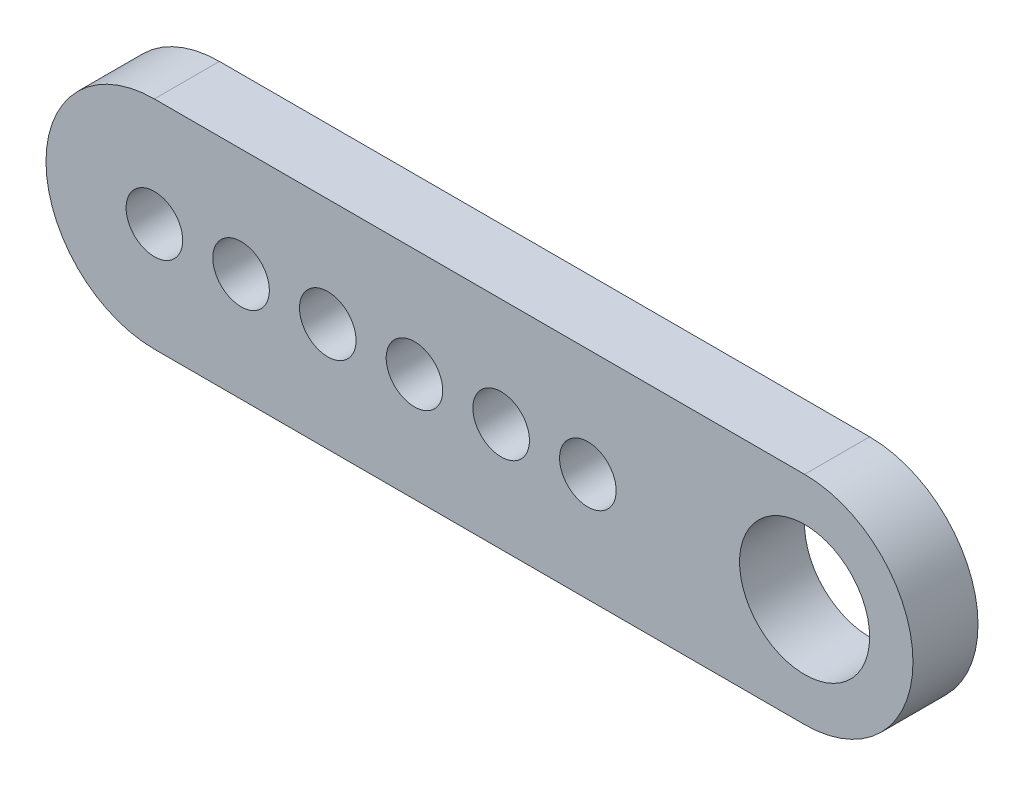
ISO-10303-21;
HEADER;
FILE_DESCRIPTION(('STEP AP214'),'2;1');
FILE_NAME('part.step','',(''),(''),'','','');
FILE_SCHEMA(('AUTOMOTIVE_DESIGN { 1 0 10303 214 1 1 1 1 }'));
ENDSEC;
DATA;
#1=APPLICATION_CONTEXT('core data for automotive mechanical design processes');
#2=APPLICATION_PROTOCOL_DEFINITION('international standard','automotive_design',2000,#1);
#3=PRODUCT_CONTEXT('',#1,'mechanical');
#4=PRODUCT('Part','Part','',(#3));
#5=PRODUCT_RELATED_PRODUCT_CATEGORY('part','',(#4));
#6=PRODUCT_DEFINITION_FORMATION('','',#4);
#7=PRODUCT_DEFINITION_CONTEXT('part definition',#1,'design');
#8=PRODUCT_DEFINITION('design','',#6,#7);
#9=PRODUCT_DEFINITION_SHAPE('','',#8);
#10=(LENGTH_UNIT() NAMED_UNIT(*) SI_UNIT(.MILLI.,.METRE.));
#11=(NAMED_UNIT(*) PLANE_ANGLE_UNIT() SI_UNIT($,.RADIAN.));
#12=(NAMED_UNIT(*) SI_UNIT($,.STERADIAN.) SOLID_ANGLE_UNIT());
#13=UNCERTAINTY_MEASURE_WITH_UNIT(LENGTH_MEASURE(1.E-05),#10,'distance_accuracy_value','');
#14=(GEOMETRIC_REPRESENTATION_CONTEXT(3) GLOBAL_UNCERTAINTY_ASSIGNED_CONTEXT((#13)) GLOBAL_UNIT_ASSIGNED_CONTEXT((#10,
#11,#12)) REPRESENTATION_CONTEXT('',''));
#15=CARTESIAN_POINT('',(0.,0.,0.));
#16=DIRECTION('',(0.,0.,1.));
#17=DIRECTION('',(1.,0.,0.));
#18=AXIS2_PLACEMENT_3D('',#15,#16,#17);
#19=CARTESIAN_POINT('',(0.,5.,3.));
#20=DIRECTION('',(0.,1.,0.));
#21=DIRECTION('',(0.,0.,1.));
#22=AXIS2_PLACEMENT_3D('',#19,#20,#21);
#23=PLANE('',#22);
#24=DIRECTION('',(1.,0.,0.));
#25=VECTOR('',#24,1.);
#26=CARTESIAN_POINT('',(0.,5.,0.));
#27=LINE('',#26,#25);
#28=CARTESIAN_POINT('',(-30.,5.,0.));
#29=VERTEX_POINT('',#28);
#30=CARTESIAN_POINT('',(0.,5.,0.));
#31=VERTEX_POINT('',#30);
#32=EDGE_CURVE('E125',#29,#31,#27,.T.);
#33=ORIENTED_EDGE('',*,*,#32,.F.);
#34=DIRECTION('',(0.,0.,-1.));
#35=VECTOR('',#34,1.);
#36=CARTESIAN_POINT('',(-30.,5.,3.));
#37=LINE('',#36,#35);
#38=CARTESIAN_POINT('',(-30.,5.,3.));
#39=VERTEX_POINT('',#38);
#40=EDGE_CURVE('E11',#39,#29,#37,.T.);
#41=ORIENTED_EDGE('',*,*,#40,.F.);
#42=DIRECTION('',(1.,0.,0.));
#43=VECTOR('',#42,1.);
#44=CARTESIAN_POINT('',(0.,5.,3.));
#45=LINE('',#44,#43);
#46=CARTESIAN_POINT('',(0.,5.,3.));
#47=VERTEX_POINT('',#46);
#48=EDGE_CURVE('E89',#39,#47,#45,.T.);
#49=ORIENTED_EDGE('',*,*,#48,.T.);
#50=DIRECTION('',(0.,0.,-1.));
#51=VECTOR('',#50,1.);
#52=CARTESIAN_POINT('',(0.,5.,3.));
#53=LINE('',#52,#51);
#54=EDGE_CURVE('E78',#47,#31,#53,.T.);
#55=ORIENTED_EDGE('',*,*,#54,.T.);
#56=EDGE_LOOP('',(#33,#41,#49,#55));
#57=FACE_BOUND('',#56,.T.);
#58=ADVANCED_FACE('F39',(#57),#23,.T.);
#59=CARTESIAN_POINT('',(-30.,0.,3.));
#60=DIRECTION('',(0.,0.,-1.));
#61=DIRECTION('',(-1.,0.,0.));
#62=AXIS2_PLACEMENT_3D('',#59,#60,#61);
#63=CYLINDRICAL_SURFACE('',#62,5.);
#64=CARTESIAN_POINT('',(-30.,0.,0.));
#65=DIRECTION('',(0.,0.,1.));
#66=DIRECTION('',(1.,0.,0.));
#67=AXIS2_PLACEMENT_3D('',#64,#65,#66);
#68=CIRCLE('',#67,5.);
#69=CARTESIAN_POINT('',(-30.,-5.,0.));
#70=VERTEX_POINT('',#69);
#71=EDGE_CURVE('E95',#29,#70,#68,.T.);
#72=ORIENTED_EDGE('',*,*,#71,.T.);
#73=DIRECTION('',(0.,0.,-1.));
#74=VECTOR('',#73,1.);
#75=CARTESIAN_POINT('',(-30.,-5.,3.));
#76=LINE('',#75,#74);
#77=CARTESIAN_POINT('',(-30.,-5.,3.));
#78=VERTEX_POINT('',#77);
#79=EDGE_CURVE('E48',#78,#70,#76,.T.);
#80=ORIENTED_EDGE('',*,*,#79,.F.);
#81=CARTESIAN_POINT('',(-30.,0.,3.));
#82=DIRECTION('',(0.,0.,1.));
#83=DIRECTION('',(1.,0.,0.));
#84=AXIS2_PLACEMENT_3D('',#81,#82,#83);
#85=CIRCLE('',#84,5.);
#86=EDGE_CURVE('E83',#39,#78,#85,.T.);
#87=ORIENTED_EDGE('',*,*,#86,.F.);
#88=ORIENTED_EDGE('',*,*,#40,.T.);
#89=EDGE_LOOP('',(#72,#80,#87,#88));
#90=FACE_BOUND('',#89,.T.);
#91=ADVANCED_FACE('F93',(#90),#63,.T.);
#92=CARTESIAN_POINT('',(0.,-5.,3.));
#93=DIRECTION('',(0.,-1.,0.));
#94=DIRECTION('',(0.,0.,-1.));
#95=AXIS2_PLACEMENT_3D('',#92,#93,#94);
#96=PLANE('',#95);
#97=DIRECTION('',(-1.,0.,0.));
#98=VECTOR('',#97,1.);
#99=CARTESIAN_POINT('',(0.,-5.,0.));
#100=LINE('',#99,#98);
#101=CARTESIAN_POINT('',(0.,-5.,0.));
#102=VERTEX_POINT('',#101);
#103=EDGE_CURVE('E129',#102,#70,#100,.T.);
#104=ORIENTED_EDGE('',*,*,#103,.F.);
#105=DIRECTION('',(0.,0.,-1.));
#106=VECTOR('',#105,1.);
#107=CARTESIAN_POINT('',(0.,-5.,3.));
#108=LINE('',#107,#106);
#109=CARTESIAN_POINT('',(0.,-5.,3.));
#110=VERTEX_POINT('',#109);
#111=EDGE_CURVE('E71',#110,#102,#108,.T.);
#112=ORIENTED_EDGE('',*,*,#111,.F.);
#113=DIRECTION('',(-1.,0.,0.));
#114=VECTOR('',#113,1.);
#115=CARTESIAN_POINT('',(0.,-5.,3.));
#116=LINE('',#115,#114);
#117=EDGE_CURVE('E88',#110,#78,#116,.T.);
#118=ORIENTED_EDGE('',*,*,#117,.T.);
#119=ORIENTED_EDGE('',*,*,#79,.T.);
#120=EDGE_LOOP('',(#104,#112,#118,#119));
#121=FACE_BOUND('',#120,.T.);
#122=ADVANCED_FACE('F99',(#121),#96,.T.);
#123=CARTESIAN_POINT('',(0.,0.,3.));
#124=DIRECTION('',(0.,0.,-1.));
#125=DIRECTION('',(-1.,0.,0.));
#126=AXIS2_PLACEMENT_3D('',#123,#124,#125);
#127=CYLINDRICAL_SURFACE('',#126,5.);
#128=CARTESIAN_POINT('',(0.,0.,0.));
#129=DIRECTION('',(0.,0.,1.));
#130=DIRECTION('',(1.,0.,0.));
#131=AXIS2_PLACEMENT_3D('',#128,#129,#130);
#132=CIRCLE('',#131,5.);
#133=EDGE_CURVE('E131',#102,#31,#132,.T.);
#134=ORIENTED_EDGE('',*,*,#133,.T.);
#135=ORIENTED_EDGE('',*,*,#54,.F.);
#136=CARTESIAN_POINT('',(0.,0.,3.));
#137=DIRECTION('',(0.,0.,1.));
#138=DIRECTION('',(1.,0.,0.));
#139=AXIS2_PLACEMENT_3D('',#136,#137,#138);
#140=CIRCLE('',#139,5.);
#141=EDGE_CURVE('E56',#110,#47,#140,.T.);
#142=ORIENTED_EDGE('',*,*,#141,.F.);
#143=ORIENTED_EDGE('',*,*,#111,.T.);
#144=EDGE_LOOP('',(#134,#135,#142,#143));
#145=FACE_BOUND('',#144,.T.);
#146=ADVANCED_FACE('F171',(#145),#127,.T.);
#147=CARTESIAN_POINT('',(-30.,0.,3.));
#148=DIRECTION('',(0.,0.,-1.));
#149=DIRECTION('',(-1.,0.,0.));
#150=AXIS2_PLACEMENT_3D('',#147,#148,#149);
#151=CYLINDRICAL_SURFACE('',#150,1.30510347340224);
#152=CARTESIAN_POINT('',(-30.,0.,3.));
#153=DIRECTION('',(0.,0.,1.));
#154=DIRECTION('',(1.,0.,0.));
#155=AXIS2_PLACEMENT_3D('',#152,#153,#154);
#156=CIRCLE('',#155,1.30510347340224);
#157=CARTESIAN_POINT('',(-28.6948965265978,0.,3.));
#158=VERTEX_POINT('',#157);
#159=EDGE_CURVE('E157',#158,#158,#156,.T.);
#160=ORIENTED_EDGE('',*,*,#159,.T.);
#161=EDGE_LOOP('',(#160));
#162=FACE_BOUND('',#161,.T.);
#163=CARTESIAN_POINT('',(-30.,0.,0.));
#164=DIRECTION('',(0.,0.,1.));
#165=DIRECTION('',(1.,0.,0.));
#166=AXIS2_PLACEMENT_3D('',#163,#164,#165);
#167=CIRCLE('',#166,1.30510347340224);
#168=CARTESIAN_POINT('',(-28.6948965265978,0.,0.));
#169=VERTEX_POINT('',#168);
#170=EDGE_CURVE('E122',#169,#169,#167,.T.);
#171=ORIENTED_EDGE('',*,*,#170,.F.);
#172=EDGE_LOOP('',(#171));
#173=FACE_BOUND('',#172,.T.);
#174=ADVANCED_FACE('F167',(#162,#173),#151,.F.);
#175=CARTESIAN_POINT('',(-26.,0.,3.));
#176=DIRECTION('',(0.,0.,-1.));
#177=DIRECTION('',(-1.,0.,0.));
#178=AXIS2_PLACEMENT_3D('',#175,#176,#177);
#179=CYLINDRICAL_SURFACE('',#178,1.30510347340224);
#180=CARTESIAN_POINT('',(-26.,0.,3.));
#181=DIRECTION('',(0.,0.,1.));
#182=DIRECTION('',(1.,0.,0.));
#183=AXIS2_PLACEMENT_3D('',#180,#181,#182);
#184=CIRCLE('',#183,1.30510347340224);
#185=CARTESIAN_POINT('',(-24.6948965265978,0.,3.));
#186=VERTEX_POINT('',#185);
#187=EDGE_CURVE('E154',#186,#186,#184,.T.);
#188=ORIENTED_EDGE('',*,*,#187,.T.);
#189=EDGE_LOOP('',(#188));
#190=FACE_BOUND('',#189,.T.);
#191=CARTESIAN_POINT('',(-26.,0.,0.));
#192=DIRECTION('',(0.,0.,1.));
#193=DIRECTION('',(1.,0.,0.));
#194=AXIS2_PLACEMENT_3D('',#191,#192,#193);
#195=CIRCLE('',#194,1.30510347340224);
#196=CARTESIAN_POINT('',(-24.6948965265978,0.,0.));
#197=VERTEX_POINT('',#196);
#198=EDGE_CURVE('E119',#197,#197,#195,.T.);
#199=ORIENTED_EDGE('',*,*,#198,.F.);
#200=EDGE_LOOP('',(#199));
#201=FACE_BOUND('',#200,.T.);
#202=ADVANCED_FACE('F170',(#190,#201),#179,.F.);
#203=CARTESIAN_POINT('',(-22.,0.,3.));
#204=DIRECTION('',(0.,0.,-1.));
#205=DIRECTION('',(-1.,0.,0.));
#206=AXIS2_PLACEMENT_3D('',#203,#204,#205);
#207=CYLINDRICAL_SURFACE('',#206,1.30510347340224);
#208=CARTESIAN_POINT('',(-22.,0.,3.));
#209=DIRECTION('',(0.,0.,1.));
#210=DIRECTION('',(1.,0.,0.));
#211=AXIS2_PLACEMENT_3D('',#208,#209,#210);
#212=CIRCLE('',#211,1.30510347340224);
#213=CARTESIAN_POINT('',(-20.6948965265978,0.,3.));
#214=VERTEX_POINT('',#213);
#215=EDGE_CURVE('E151',#214,#214,#212,.T.);
#216=ORIENTED_EDGE('',*,*,#215,.T.);
#217=EDGE_LOOP('',(#216));
#218=FACE_BOUND('',#217,.T.);
#219=CARTESIAN_POINT('',(-22.,0.,0.));
#220=DIRECTION('',(0.,0.,1.));
#221=DIRECTION('',(1.,0.,0.));
#222=AXIS2_PLACEMENT_3D('',#219,#220,#221);
#223=CIRCLE('',#222,1.30510347340224);
#224=CARTESIAN_POINT('',(-20.6948965265978,0.,0.));
#225=VERTEX_POINT('',#224);
#226=EDGE_CURVE('E116',#225,#225,#223,.T.);
#227=ORIENTED_EDGE('',*,*,#226,.F.);
#228=EDGE_LOOP('',(#227));
#229=FACE_BOUND('',#228,.T.);
#230=ADVANCED_FACE('F175',(#218,#229),#207,.F.);
#231=CARTESIAN_POINT('',(-18.,0.,3.));
#232=DIRECTION('',(0.,0.,-1.));
#233=DIRECTION('',(-1.,0.,0.));
#234=AXIS2_PLACEMENT_3D('',#231,#232,#233);
#235=CYLINDRICAL_SURFACE('',#234,1.30510347340224);
#236=CARTESIAN_POINT('',(-18.,0.,3.));
#237=DIRECTION('',(0.,0.,1.));
#238=DIRECTION('',(1.,0.,0.));
#239=AXIS2_PLACEMENT_3D('',#236,#237,#238);
#240=CIRCLE('',#239,1.30510347340224);
#241=CARTESIAN_POINT('',(-16.6948965265978,0.,3.));
#242=VERTEX_POINT('',#241);
#243=EDGE_CURVE('E146',#242,#242,#240,.T.);
#244=ORIENTED_EDGE('',*,*,#243,.T.);
#245=EDGE_LOOP('',(#244));
#246=FACE_BOUND('',#245,.T.);
#247=CARTESIAN_POINT('',(-18.,0.,0.));
#248=DIRECTION('',(0.,0.,1.));
#249=DIRECTION('',(1.,0.,0.));
#250=AXIS2_PLACEMENT_3D('',#247,#248,#249);
#251=CIRCLE('',#250,1.30510347340224);
#252=CARTESIAN_POINT('',(-16.6948965265978,0.,0.));
#253=VERTEX_POINT('',#252);
#254=EDGE_CURVE('E113',#253,#253,#251,.T.);
#255=ORIENTED_EDGE('',*,*,#254,.F.);
#256=EDGE_LOOP('',(#255));
#257=FACE_BOUND('',#256,.T.);
#258=ADVANCED_FACE('F179',(#246,#257),#235,.F.);
#259=CARTESIAN_POINT('',(-14.,0.,3.));
#260=DIRECTION('',(0.,0.,-1.));
#261=DIRECTION('',(-1.,0.,0.));
#262=AXIS2_PLACEMENT_3D('',#259,#260,#261);
#263=CYLINDRICAL_SURFACE('',#262,1.30510347340224);
#264=CARTESIAN_POINT('',(-14.,0.,3.));
#265=DIRECTION('',(0.,0.,1.));
#266=DIRECTION('',(1.,0.,0.));
#267=AXIS2_PLACEMENT_3D('',#264,#265,#266);
#268=CIRCLE('',#267,1.30510347340224);
#269=CARTESIAN_POINT('',(-12.6948965265978,0.,3.));
#270=VERTEX_POINT('',#269);
#271=EDGE_CURVE('E141',#270,#270,#268,.T.);
#272=ORIENTED_EDGE('',*,*,#271,.T.);
#273=EDGE_LOOP('',(#272));
#274=FACE_BOUND('',#273,.T.);
#275=CARTESIAN_POINT('',(-14.,0.,0.));
#276=DIRECTION('',(0.,0.,1.));
#277=DIRECTION('',(1.,0.,0.));
#278=AXIS2_PLACEMENT_3D('',#275,#276,#277);
#279=CIRCLE('',#278,1.30510347340224);
#280=CARTESIAN_POINT('',(-12.6948965265978,0.,0.));
#281=VERTEX_POINT('',#280);
#282=EDGE_CURVE('E110',#281,#281,#279,.T.);
#283=ORIENTED_EDGE('',*,*,#282,.F.);
#284=EDGE_LOOP('',(#283));
#285=FACE_BOUND('',#284,.T.);
#286=ADVANCED_FACE('F182',(#274,#285),#263,.F.);
#287=CARTESIAN_POINT('',(-10.,0.,3.));
#288=DIRECTION('',(0.,0.,-1.));
#289=DIRECTION('',(-1.,0.,0.));
#290=AXIS2_PLACEMENT_3D('',#287,#288,#289);
#291=CYLINDRICAL_SURFACE('',#290,1.30510347340224);
#292=CARTESIAN_POINT('',(-10.,0.,3.));
#293=DIRECTION('',(0.,0.,1.));
#294=DIRECTION('',(1.,0.,0.));
#295=AXIS2_PLACEMENT_3D('',#292,#293,#294);
#296=CIRCLE('',#295,1.30510347340224);
#297=CARTESIAN_POINT('',(-8.69489652659775,0.,3.));
#298=VERTEX_POINT('',#297);
#299=EDGE_CURVE('E136',#298,#298,#296,.T.);
#300=ORIENTED_EDGE('',*,*,#299,.T.);
#301=EDGE_LOOP('',(#300));
#302=FACE_BOUND('',#301,.T.);
#303=CARTESIAN_POINT('',(-10.,0.,0.));
#304=DIRECTION('',(0.,0.,1.));
#305=DIRECTION('',(1.,0.,0.));
#306=AXIS2_PLACEMENT_3D('',#303,#304,#305);
#307=CIRCLE('',#306,1.30510347340224);
#308=CARTESIAN_POINT('',(-8.69489652659775,0.,0.));
#309=VERTEX_POINT('',#308);
#310=EDGE_CURVE('E107',#309,#309,#307,.T.);
#311=ORIENTED_EDGE('',*,*,#310,.F.);
#312=EDGE_LOOP('',(#311));
#313=FACE_BOUND('',#312,.T.);
#314=ADVANCED_FACE('F41',(#302,#313),#291,.F.);
#315=CARTESIAN_POINT('',(0.,0.,3.));
#316=DIRECTION('',(0.,0.,-1.));
#317=DIRECTION('',(-1.,0.,0.));
#318=AXIS2_PLACEMENT_3D('',#315,#316,#317);
#319=CYLINDRICAL_SURFACE('',#318,3.);
#320=CARTESIAN_POINT('',(0.,0.,3.));
#321=DIRECTION('',(0.,0.,1.));
#322=DIRECTION('',(1.,0.,0.));
#323=AXIS2_PLACEMENT_3D('',#320,#321,#322);
#324=CIRCLE('',#323,3.);
#325=CARTESIAN_POINT('',(3.,0.,3.));
#326=VERTEX_POINT('',#325);
#327=EDGE_CURVE('E101',#326,#326,#324,.T.);
#328=ORIENTED_EDGE('',*,*,#327,.T.);
#329=EDGE_LOOP('',(#328));
#330=FACE_BOUND('',#329,.T.);
#331=CARTESIAN_POINT('',(0.,0.,0.));
#332=DIRECTION('',(0.,0.,1.));
#333=DIRECTION('',(1.,0.,0.));
#334=AXIS2_PLACEMENT_3D('',#331,#332,#333);
#335=CIRCLE('',#334,3.);
#336=CARTESIAN_POINT('',(3.,0.,0.));
#337=VERTEX_POINT('',#336);
#338=EDGE_CURVE('E133',#337,#337,#335,.T.);
#339=ORIENTED_EDGE('',*,*,#338,.F.);
#340=EDGE_LOOP('',(#339));
#341=FACE_BOUND('',#340,.T.);
#342=ADVANCED_FACE('F189',(#330,#341),#319,.F.);
#343=CARTESIAN_POINT('',(0.,0.,3.));
#344=DIRECTION('',(0.,0.,1.));
#345=DIRECTION('',(1.,0.,0.));
#346=AXIS2_PLACEMENT_3D('',#343,#344,#345);
#347=PLANE('',#346);
#348=ORIENTED_EDGE('',*,*,#299,.F.);
#349=EDGE_LOOP('',(#348));
#350=FACE_BOUND('',#349,.T.);
#351=ORIENTED_EDGE('',*,*,#271,.F.);
#352=EDGE_LOOP('',(#351));
#353=FACE_BOUND('',#352,.T.);
#354=ORIENTED_EDGE('',*,*,#243,.F.);
#355=EDGE_LOOP('',(#354));
#356=FACE_BOUND('',#355,.T.);
#357=ORIENTED_EDGE('',*,*,#215,.F.);
#358=EDGE_LOOP('',(#357));
#359=FACE_BOUND('',#358,.T.);
#360=ORIENTED_EDGE('',*,*,#187,.F.);
#361=EDGE_LOOP('',(#360));
#362=FACE_BOUND('',#361,.T.);
#363=ORIENTED_EDGE('',*,*,#159,.F.);
#364=EDGE_LOOP('',(#363));
#365=FACE_BOUND('',#364,.T.);
#366=ORIENTED_EDGE('',*,*,#48,.F.);
#367=ORIENTED_EDGE('',*,*,#86,.T.);
#368=ORIENTED_EDGE('',*,*,#117,.F.);
#369=ORIENTED_EDGE('',*,*,#141,.T.);
#370=EDGE_LOOP('',(#366,#367,#368,#369));
#371=FACE_BOUND('',#370,.T.);
#372=ORIENTED_EDGE('',*,*,#327,.F.);
#373=EDGE_LOOP('',(#372));
#374=FACE_BOUND('',#373,.T.);
#375=ADVANCED_FACE('F85',(#350,#353,#356,#359,#362,#365,#371,#374),#347,.T.);
#376=CARTESIAN_POINT('',(0.,0.,0.));
#377=DIRECTION('',(0.,0.,1.));
#378=DIRECTION('',(1.,0.,0.));
#379=AXIS2_PLACEMENT_3D('',#376,#377,#378);
#380=PLANE('',#379);
#381=ORIENTED_EDGE('',*,*,#310,.T.);
#382=EDGE_LOOP('',(#381));
#383=FACE_BOUND('',#382,.T.);
#384=ORIENTED_EDGE('',*,*,#282,.T.);
#385=EDGE_LOOP('',(#384));
#386=FACE_BOUND('',#385,.T.);
#387=ORIENTED_EDGE('',*,*,#254,.T.);
#388=EDGE_LOOP('',(#387));
#389=FACE_BOUND('',#388,.T.);
#390=ORIENTED_EDGE('',*,*,#226,.T.);
#391=EDGE_LOOP('',(#390));
#392=FACE_BOUND('',#391,.T.);
#393=ORIENTED_EDGE('',*,*,#198,.T.);
#394=EDGE_LOOP('',(#393));
#395=FACE_BOUND('',#394,.T.);
#396=ORIENTED_EDGE('',*,*,#170,.T.);
#397=EDGE_LOOP('',(#396));
#398=FACE_BOUND('',#397,.T.);
#399=ORIENTED_EDGE('',*,*,#32,.T.);
#400=ORIENTED_EDGE('',*,*,#133,.F.);
#401=ORIENTED_EDGE('',*,*,#103,.T.);
#402=ORIENTED_EDGE('',*,*,#71,.F.);
#403=EDGE_LOOP('',(#399,#400,#401,#402));
#404=FACE_BOUND('',#403,.T.);
#405=ORIENTED_EDGE('',*,*,#338,.T.);
#406=EDGE_LOOP('',(#405));
#407=FACE_BOUND('',#406,.T.);
#408=ADVANCED_FACE('F194',(#383,#386,#389,#392,#395,#398,#404,#407),#380,.F.);
#409=CLOSED_SHELL('',(#58,#91,#122,#146,#174,#202,#230,#258,#286,#314,#342,#375,#408));
#410=MANIFOLD_SOLID_BREP('B2',#409);
#411=ADVANCED_BREP_SHAPE_REPRESENTATION('',(#18,#410),#14);
#412=SHAPE_DEFINITION_REPRESENTATION(#9,#411);
ENDSEC;
END-ISO-10303-21;
